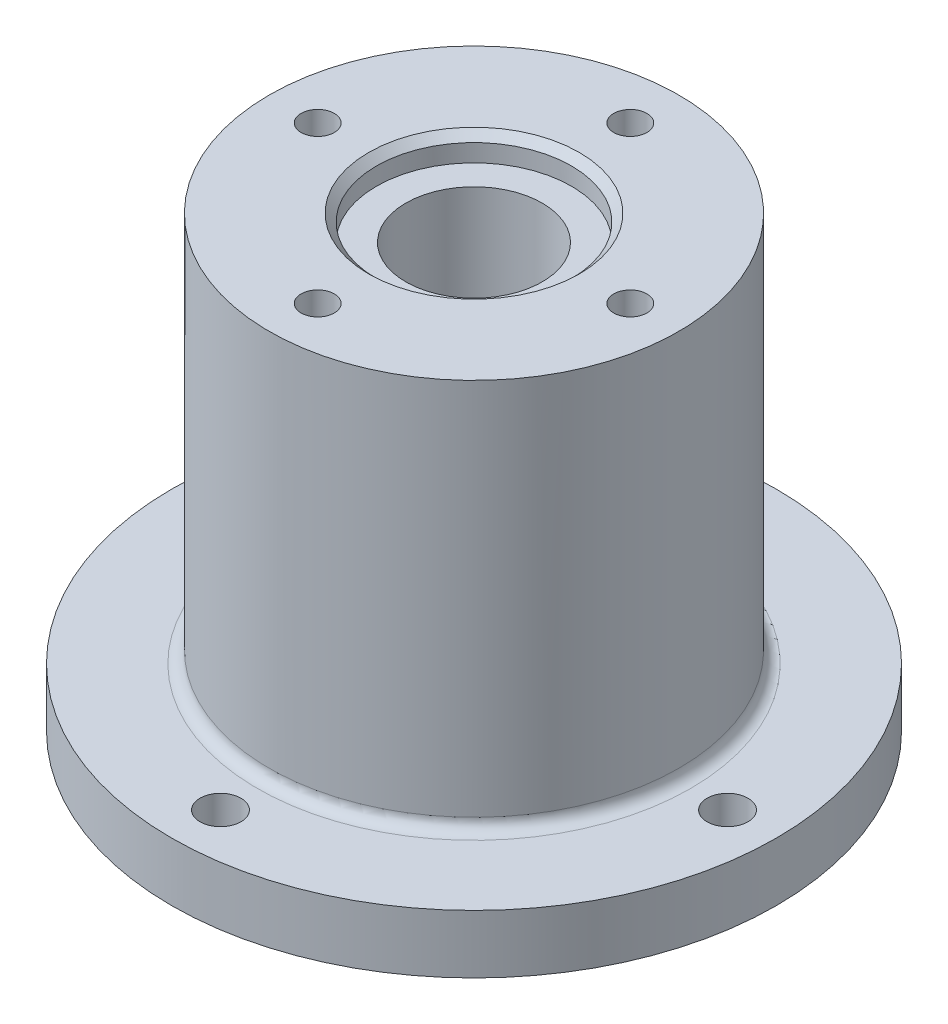
ISO-10303-21;
HEADER;
FILE_DESCRIPTION(('STEP AP214'),'2;1');
FILE_NAME('part.step','',(''),(''),'','','');
FILE_SCHEMA(('AUTOMOTIVE_DESIGN { 1 0 10303 214 1 1 1 1 }'));
ENDSEC;
DATA;
#1=APPLICATION_CONTEXT('core data for automotive mechanical design processes');
#2=APPLICATION_PROTOCOL_DEFINITION('international standard','automotive_design',2000,#1);
#3=PRODUCT_CONTEXT('',#1,'mechanical');
#4=PRODUCT('Part','Part','',(#3));
#5=PRODUCT_RELATED_PRODUCT_CATEGORY('part','',(#4));
#6=PRODUCT_DEFINITION_FORMATION('','',#4);
#7=PRODUCT_DEFINITION_CONTEXT('part definition',#1,'design');
#8=PRODUCT_DEFINITION('design','',#6,#7);
#9=PRODUCT_DEFINITION_SHAPE('','',#8);
#10=(LENGTH_UNIT() NAMED_UNIT(*) SI_UNIT(.MILLI.,.METRE.));
#11=(NAMED_UNIT(*) PLANE_ANGLE_UNIT() SI_UNIT($,.RADIAN.));
#12=(NAMED_UNIT(*) SI_UNIT($,.STERADIAN.) SOLID_ANGLE_UNIT());
#13=UNCERTAINTY_MEASURE_WITH_UNIT(LENGTH_MEASURE(1.E-05),#10,'distance_accuracy_value','');
#14=(GEOMETRIC_REPRESENTATION_CONTEXT(3) GLOBAL_UNCERTAINTY_ASSIGNED_CONTEXT((#13)) GLOBAL_UNIT_ASSIGNED_CONTEXT((#10,
#11,#12)) REPRESENTATION_CONTEXT('',''));
#15=CARTESIAN_POINT('',(0.,0.,0.));
#16=DIRECTION('',(0.,0.,1.));
#17=DIRECTION('',(1.,0.,0.));
#18=AXIS2_PLACEMENT_3D('',#15,#16,#17);
#19=CARTESIAN_POINT('',(52.5,115.,0.));
#20=DIRECTION('',(0.,-1.,0.));
#21=DIRECTION('',(1.,0.,0.));
#22=AXIS2_PLACEMENT_3D('',#19,#20,#21);
#23=PLANE('',#22);
#24=CARTESIAN_POINT('',(-4.3163367866924E-13,115.,-40.0726216412491));
#25=DIRECTION('',(0.,1.,0.));
#26=DIRECTION('',(0.,0.,1.));
#27=AXIS2_PLACEMENT_3D('',#24,#25,#26);
#28=CIRCLE('',#27,4.24999999999999);
#29=CARTESIAN_POINT('',(-4.3163367866924E-13,115.,-35.8226216412491));
#30=VERTEX_POINT('',#29);
#31=EDGE_CURVE('E89',#30,#30,#28,.T.);
#32=ORIENTED_EDGE('',*,*,#31,.F.);
#33=EDGE_LOOP('',(#32));
#34=FACE_BOUND('',#33,.T.);
#35=CARTESIAN_POINT('',(40.0726216412491,115.,0.));
#36=DIRECTION('',(0.,1.,0.));
#37=DIRECTION('',(0.,0.,1.));
#38=AXIS2_PLACEMENT_3D('',#35,#36,#37);
#39=CIRCLE('',#38,4.24999999999999);
#40=CARTESIAN_POINT('',(40.0726216412491,115.,4.24999999999999));
#41=VERTEX_POINT('',#40);
#42=EDGE_CURVE('E88',#41,#41,#39,.T.);
#43=ORIENTED_EDGE('',*,*,#42,.F.);
#44=EDGE_LOOP('',(#43));
#45=FACE_BOUND('',#44,.T.);
#46=CARTESIAN_POINT('',(1.2801756396653E-13,115.,40.0726216412491));
#47=DIRECTION('',(0.,1.,0.));
#48=DIRECTION('',(0.,0.,1.));
#49=AXIS2_PLACEMENT_3D('',#46,#47,#48);
#50=CIRCLE('',#49,4.24999999999999);
#51=CARTESIAN_POINT('',(1.2801756396653E-13,115.,44.3226216412491));
#52=VERTEX_POINT('',#51);
#53=EDGE_CURVE('E104',#52,#52,#50,.T.);
#54=ORIENTED_EDGE('',*,*,#53,.F.);
#55=EDGE_LOOP('',(#54));
#56=FACE_BOUND('',#55,.T.);
#57=CARTESIAN_POINT('',(-40.0726216412491,115.,0.));
#58=DIRECTION('',(0.,1.,0.));
#59=DIRECTION('',(0.,0.,1.));
#60=AXIS2_PLACEMENT_3D('',#57,#58,#59);
#61=CIRCLE('',#60,4.24999999999999);
#62=CARTESIAN_POINT('',(-40.0726216412491,115.,4.24999999999999));
#63=VERTEX_POINT('',#62);
#64=EDGE_CURVE('E112',#63,#63,#61,.T.);
#65=ORIENTED_EDGE('',*,*,#64,.F.);
#66=EDGE_LOOP('',(#65));
#67=FACE_BOUND('',#66,.T.);
#68=CARTESIAN_POINT('',(0.,115.,0.));
#69=DIRECTION('',(0.,-1.,0.));
#70=DIRECTION('',(1.,0.,0.));
#71=AXIS2_PLACEMENT_3D('',#68,#69,#70);
#72=CIRCLE('',#71,27.);
#73=CARTESIAN_POINT('',(27.,115.,0.));
#74=VERTEX_POINT('',#73);
#75=EDGE_CURVE('E11',#74,#74,#72,.T.);
#76=ORIENTED_EDGE('',*,*,#75,.T.);
#77=EDGE_LOOP('',(#76));
#78=FACE_BOUND('',#77,.T.);
#79=CARTESIAN_POINT('',(0.,115.,0.));
#80=DIRECTION('',(0.,1.,0.));
#81=DIRECTION('',(-1.,0.,0.));
#82=AXIS2_PLACEMENT_3D('',#79,#80,#81);
#83=CIRCLE('',#82,52.5);
#84=CARTESIAN_POINT('',(-52.5,115.,0.));
#85=VERTEX_POINT('',#84);
#86=EDGE_CURVE('E184',#85,#85,#83,.T.);
#87=ORIENTED_EDGE('',*,*,#86,.T.);
#88=EDGE_LOOP('',(#87));
#89=FACE_BOUND('',#88,.T.);
#90=ADVANCED_FACE('F55',(#34,#45,#56,#67,#78,#89),#23,.F.);
#91=CARTESIAN_POINT('',(0.,-0.774116111795951,0.));
#92=DIRECTION('',(0.,1.,0.));
#93=DIRECTION('',(-1.,0.,0.));
#94=AXIS2_PLACEMENT_3D('',#91,#92,#93);
#95=CYLINDRICAL_SURFACE('',#94,52.5);
#96=CARTESIAN_POINT('',(0.,18.,0.));
#97=DIRECTION('',(0.,-1.,0.));
#98=DIRECTION('',(1.,0.,0.));
#99=AXIS2_PLACEMENT_3D('',#96,#97,#98);
#100=CIRCLE('',#99,52.5);
#101=CARTESIAN_POINT('',(52.5,18.,0.));
#102=VERTEX_POINT('',#101);
#103=EDGE_CURVE('E188',#102,#102,#100,.F.);
#104=ORIENTED_EDGE('',*,*,#103,.T.);
#105=EDGE_LOOP('',(#104));
#106=FACE_BOUND('',#105,.T.);
#107=ORIENTED_EDGE('',*,*,#86,.F.);
#108=EDGE_LOOP('',(#107));
#109=FACE_BOUND('',#108,.T.);
#110=ADVANCED_FACE('F235',(#106,#109),#95,.T.);
#111=CARTESIAN_POINT('',(77.5,15.,0.));
#112=DIRECTION('',(0.,-1.,0.));
#113=DIRECTION('',(1.,0.,0.));
#114=AXIS2_PLACEMENT_3D('',#111,#112,#113);
#115=PLANE('',#114);
#116=CARTESIAN_POINT('',(0.,15.,-65.));
#117=DIRECTION('',(0.,1.,0.));
#118=DIRECTION('',(0.,0.,1.));
#119=AXIS2_PLACEMENT_3D('',#116,#117,#118);
#120=CIRCLE('',#119,5.24999999999999);
#121=CARTESIAN_POINT('',(0.,15.,-59.75));
#122=VERTEX_POINT('',#121);
#123=EDGE_CURVE('E120',#122,#122,#120,.T.);
#124=ORIENTED_EDGE('',*,*,#123,.F.);
#125=EDGE_LOOP('',(#124));
#126=FACE_BOUND('',#125,.T.);
#127=CARTESIAN_POINT('',(65.,15.,0.));
#128=DIRECTION('',(0.,1.,0.));
#129=DIRECTION('',(0.,0.,1.));
#130=AXIS2_PLACEMENT_3D('',#127,#128,#129);
#131=CIRCLE('',#130,5.24999999999999);
#132=CARTESIAN_POINT('',(65.,15.,5.24999999999999));
#133=VERTEX_POINT('',#132);
#134=EDGE_CURVE('E128',#133,#133,#131,.T.);
#135=ORIENTED_EDGE('',*,*,#134,.F.);
#136=EDGE_LOOP('',(#135));
#137=FACE_BOUND('',#136,.T.);
#138=CARTESIAN_POINT('',(0.,15.,65.));
#139=DIRECTION('',(0.,1.,0.));
#140=DIRECTION('',(0.,0.,1.));
#141=AXIS2_PLACEMENT_3D('',#138,#139,#140);
#142=CIRCLE('',#141,5.24999999999999);
#143=CARTESIAN_POINT('',(0.,15.,70.25));
#144=VERTEX_POINT('',#143);
#145=EDGE_CURVE('E136',#144,#144,#142,.T.);
#146=ORIENTED_EDGE('',*,*,#145,.F.);
#147=EDGE_LOOP('',(#146));
#148=FACE_BOUND('',#147,.T.);
#149=CARTESIAN_POINT('',(-65.,15.,0.));
#150=DIRECTION('',(0.,1.,0.));
#151=DIRECTION('',(0.,0.,1.));
#152=AXIS2_PLACEMENT_3D('',#149,#150,#151);
#153=CIRCLE('',#152,5.24999999999999);
#154=CARTESIAN_POINT('',(-65.,15.,5.24999999999999));
#155=VERTEX_POINT('',#154);
#156=EDGE_CURVE('E144',#155,#155,#153,.T.);
#157=ORIENTED_EDGE('',*,*,#156,.F.);
#158=EDGE_LOOP('',(#157));
#159=FACE_BOUND('',#158,.T.);
#160=CARTESIAN_POINT('',(0.,15.,0.));
#161=DIRECTION('',(0.,-1.,0.));
#162=DIRECTION('',(1.,0.,0.));
#163=AXIS2_PLACEMENT_3D('',#160,#161,#162);
#164=CIRCLE('',#163,55.5);
#165=CARTESIAN_POINT('',(55.5,15.,0.));
#166=VERTEX_POINT('',#165);
#167=EDGE_CURVE('E192',#166,#166,#164,.T.);
#168=ORIENTED_EDGE('',*,*,#167,.T.);
#169=EDGE_LOOP('',(#168));
#170=FACE_BOUND('',#169,.T.);
#171=CARTESIAN_POINT('',(0.,15.,0.));
#172=DIRECTION('',(0.,1.,0.));
#173=DIRECTION('',(-1.,0.,0.));
#174=AXIS2_PLACEMENT_3D('',#171,#172,#173);
#175=CIRCLE('',#174,77.5);
#176=CARTESIAN_POINT('',(-77.5,15.,0.));
#177=VERTEX_POINT('',#176);
#178=EDGE_CURVE('E180',#177,#177,#175,.T.);
#179=ORIENTED_EDGE('',*,*,#178,.T.);
#180=EDGE_LOOP('',(#179));
#181=FACE_BOUND('',#180,.T.);
#182=ADVANCED_FACE('F241',(#126,#137,#148,#159,#170,#181),#115,.F.);
#183=CARTESIAN_POINT('',(0.,-0.774116111795951,0.));
#184=DIRECTION('',(0.,1.,0.));
#185=DIRECTION('',(-1.,0.,0.));
#186=AXIS2_PLACEMENT_3D('',#183,#184,#185);
#187=CYLINDRICAL_SURFACE('',#186,77.5);
#188=ORIENTED_EDGE('',*,*,#178,.F.);
#189=EDGE_LOOP('',(#188));
#190=FACE_BOUND('',#189,.T.);
#191=CARTESIAN_POINT('',(0.,0.,0.));
#192=DIRECTION('',(0.,1.,0.));
#193=DIRECTION('',(-1.,0.,0.));
#194=AXIS2_PLACEMENT_3D('',#191,#192,#193);
#195=CIRCLE('',#194,77.5);
#196=CARTESIAN_POINT('',(-77.5,0.,0.));
#197=VERTEX_POINT('',#196);
#198=EDGE_CURVE('E176',#197,#197,#195,.T.);
#199=ORIENTED_EDGE('',*,*,#198,.T.);
#200=EDGE_LOOP('',(#199));
#201=FACE_BOUND('',#200,.T.);
#202=ADVANCED_FACE('F264',(#190,#201),#187,.T.);
#203=CARTESIAN_POINT('',(37.5,0.,0.));
#204=DIRECTION('',(0.,1.,0.));
#205=DIRECTION('',(-1.,0.,0.));
#206=AXIS2_PLACEMENT_3D('',#203,#204,#205);
#207=PLANE('',#206);
#208=CARTESIAN_POINT('',(0.,0.,-65.));
#209=DIRECTION('',(0.,1.,0.));
#210=DIRECTION('',(0.,0.,1.));
#211=AXIS2_PLACEMENT_3D('',#208,#209,#210);
#212=CIRCLE('',#211,5.24999999999999);
#213=CARTESIAN_POINT('',(0.,0.,-59.75));
#214=VERTEX_POINT('',#213);
#215=EDGE_CURVE('E124',#214,#214,#212,.T.);
#216=ORIENTED_EDGE('',*,*,#215,.T.);
#217=EDGE_LOOP('',(#216));
#218=FACE_BOUND('',#217,.T.);
#219=CARTESIAN_POINT('',(65.,0.,0.));
#220=DIRECTION('',(0.,1.,0.));
#221=DIRECTION('',(0.,0.,1.));
#222=AXIS2_PLACEMENT_3D('',#219,#220,#221);
#223=CIRCLE('',#222,5.24999999999999);
#224=CARTESIAN_POINT('',(65.,0.,5.24999999999999));
#225=VERTEX_POINT('',#224);
#226=EDGE_CURVE('E132',#225,#225,#223,.T.);
#227=ORIENTED_EDGE('',*,*,#226,.T.);
#228=EDGE_LOOP('',(#227));
#229=FACE_BOUND('',#228,.T.);
#230=CARTESIAN_POINT('',(0.,0.,65.));
#231=DIRECTION('',(0.,1.,0.));
#232=DIRECTION('',(0.,0.,1.));
#233=AXIS2_PLACEMENT_3D('',#230,#231,#232);
#234=CIRCLE('',#233,5.24999999999999);
#235=CARTESIAN_POINT('',(0.,0.,70.25));
#236=VERTEX_POINT('',#235);
#237=EDGE_CURVE('E140',#236,#236,#234,.T.);
#238=ORIENTED_EDGE('',*,*,#237,.T.);
#239=EDGE_LOOP('',(#238));
#240=FACE_BOUND('',#239,.T.);
#241=CARTESIAN_POINT('',(-65.,0.,0.));
#242=DIRECTION('',(0.,1.,0.));
#243=DIRECTION('',(0.,0.,1.));
#244=AXIS2_PLACEMENT_3D('',#241,#242,#243);
#245=CIRCLE('',#244,5.24999999999998);
#246=CARTESIAN_POINT('',(-65.,0.,5.24999999999998));
#247=VERTEX_POINT('',#246);
#248=EDGE_CURVE('E148',#247,#247,#245,.T.);
#249=ORIENTED_EDGE('',*,*,#248,.T.);
#250=EDGE_LOOP('',(#249));
#251=FACE_BOUND('',#250,.T.);
#252=CARTESIAN_POINT('',(0.,0.,0.));
#253=DIRECTION('',(0.,1.,0.));
#254=DIRECTION('',(-1.,0.,0.));
#255=AXIS2_PLACEMENT_3D('',#252,#253,#254);
#256=CIRCLE('',#255,40.3867513459481);
#257=CARTESIAN_POINT('',(-40.3867513459481,0.,0.));
#258=VERTEX_POINT('',#257);
#259=EDGE_CURVE('E196',#258,#258,#256,.T.);
#260=ORIENTED_EDGE('',*,*,#259,.T.);
#261=EDGE_LOOP('',(#260));
#262=FACE_BOUND('',#261,.T.);
#263=ORIENTED_EDGE('',*,*,#198,.F.);
#264=EDGE_LOOP('',(#263));
#265=FACE_BOUND('',#264,.T.);
#266=ADVANCED_FACE('F260',(#218,#229,#240,#251,#262,#265),#207,.F.);
#267=CARTESIAN_POINT('',(0.,32.5,0.));
#268=DIRECTION('',(0.,-1.,0.));
#269=DIRECTION('',(1.,0.,0.));
#270=AXIS2_PLACEMENT_3D('',#267,#268,#269);
#271=CONICAL_SURFACE('',#270,18.7361162513373,0.523598775598297);
#272=CARTESIAN_POINT('',(0.,2.5,0.));
#273=DIRECTION('',(0.,1.,0.));
#274=DIRECTION('',(-1.,0.,0.));
#275=AXIS2_PLACEMENT_3D('',#272,#273,#274);
#276=CIRCLE('',#275,36.0566243270259);
#277=CARTESIAN_POINT('',(-36.0566243270259,2.5,0.));
#278=VERTEX_POINT('',#277);
#279=EDGE_CURVE('E200',#278,#278,#276,.F.);
#280=ORIENTED_EDGE('',*,*,#279,.T.);
#281=EDGE_LOOP('',(#280));
#282=FACE_BOUND('',#281,.T.);
#283=CARTESIAN_POINT('',(0.,32.5,0.));
#284=DIRECTION('',(0.,1.,0.));
#285=DIRECTION('',(-1.,0.,0.));
#286=AXIS2_PLACEMENT_3D('',#283,#284,#285);
#287=CIRCLE('',#286,18.7361162513373);
#288=CARTESIAN_POINT('',(-18.7361162513373,32.5,0.));
#289=VERTEX_POINT('',#288);
#290=EDGE_CURVE('E172',#289,#289,#287,.T.);
#291=ORIENTED_EDGE('',*,*,#290,.T.);
#292=EDGE_LOOP('',(#291));
#293=FACE_BOUND('',#292,.T.);
#294=ADVANCED_FACE('F263',(#282,#293),#271,.F.);
#295=CARTESIAN_POINT('',(0.,30.,0.));
#296=DIRECTION('',(0.,1.,0.));
#297=DIRECTION('',(-1.,0.,0.));
#298=AXIS2_PLACEMENT_3D('',#295,#296,#297);
#299=TOROIDAL_SURFACE('',#298,14.4059892324151,5.);
#300=ORIENTED_EDGE('',*,*,#290,.F.);
#301=EDGE_LOOP('',(#300));
#302=FACE_BOUND('',#301,.T.);
#303=CARTESIAN_POINT('',(0.,35.,0.));
#304=DIRECTION('',(0.,1.,0.));
#305=DIRECTION('',(-1.,0.,0.));
#306=AXIS2_PLACEMENT_3D('',#303,#304,#305);
#307=CIRCLE('',#306,14.4059892324151);
#308=CARTESIAN_POINT('',(-14.4059892324151,35.,0.));
#309=VERTEX_POINT('',#308);
#310=EDGE_CURVE('E168',#309,#309,#307,.T.);
#311=ORIENTED_EDGE('',*,*,#310,.T.);
#312=EDGE_LOOP('',(#311));
#313=FACE_BOUND('',#312,.T.);
#314=ADVANCED_FACE('F280',(#302,#313),#299,.F.);
#315=CARTESIAN_POINT('',(8.,35.,0.));
#316=DIRECTION('',(0.,1.,0.));
#317=DIRECTION('',(-1.,0.,0.));
#318=AXIS2_PLACEMENT_3D('',#315,#316,#317);
#319=PLANE('',#318);
#320=ORIENTED_EDGE('',*,*,#310,.F.);
#321=EDGE_LOOP('',(#320));
#322=FACE_BOUND('',#321,.T.);
#323=CARTESIAN_POINT('',(0.,35.,0.));
#324=DIRECTION('',(0.,1.,0.));
#325=DIRECTION('',(-1.,0.,0.));
#326=AXIS2_PLACEMENT_3D('',#323,#324,#325);
#327=CIRCLE('',#326,8.);
#328=CARTESIAN_POINT('',(-8.,35.,0.));
#329=VERTEX_POINT('',#328);
#330=EDGE_CURVE('E164',#329,#329,#327,.T.);
#331=ORIENTED_EDGE('',*,*,#330,.T.);
#332=EDGE_LOOP('',(#331));
#333=FACE_BOUND('',#332,.T.);
#334=ADVANCED_FACE('F284',(#322,#333),#319,.F.);
#335=CARTESIAN_POINT('',(0.,-0.774116111795951,0.));
#336=DIRECTION('',(0.,1.,0.));
#337=DIRECTION('',(-1.,0.,0.));
#338=AXIS2_PLACEMENT_3D('',#335,#336,#337);
#339=CYLINDRICAL_SURFACE('',#338,8.);
#340=ORIENTED_EDGE('',*,*,#330,.F.);
#341=EDGE_LOOP('',(#340));
#342=FACE_BOUND('',#341,.T.);
#343=CARTESIAN_POINT('',(0.,51.,0.));
#344=DIRECTION('',(0.,1.,0.));
#345=DIRECTION('',(-1.,0.,0.));
#346=AXIS2_PLACEMENT_3D('',#343,#344,#345);
#347=CIRCLE('',#346,8.);
#348=CARTESIAN_POINT('',(-8.00000000000001,51.,0.));
#349=VERTEX_POINT('',#348);
#350=EDGE_CURVE('E160',#349,#349,#347,.T.);
#351=ORIENTED_EDGE('',*,*,#350,.T.);
#352=EDGE_LOOP('',(#351));
#353=FACE_BOUND('',#352,.T.);
#354=ADVANCED_FACE('F288',(#342,#353),#339,.F.);
#355=CARTESIAN_POINT('',(17.5,51.,0.));
#356=DIRECTION('',(0.,-1.,0.));
#357=DIRECTION('',(1.,0.,0.));
#358=AXIS2_PLACEMENT_3D('',#355,#356,#357);
#359=PLANE('',#358);
#360=CARTESIAN_POINT('',(0.,51.,0.));
#361=DIRECTION('',(0.,-1.,0.));
#362=DIRECTION('',(1.,0.,0.));
#363=AXIS2_PLACEMENT_3D('',#360,#361,#362);
#364=CIRCLE('',#363,15.);
#365=CARTESIAN_POINT('',(15.,51.,0.));
#366=VERTEX_POINT('',#365);
#367=EDGE_CURVE('E204',#366,#366,#364,.F.);
#368=ORIENTED_EDGE('',*,*,#367,.T.);
#369=EDGE_LOOP('',(#368));
#370=FACE_BOUND('',#369,.T.);
#371=ORIENTED_EDGE('',*,*,#350,.F.);
#372=EDGE_LOOP('',(#371));
#373=FACE_BOUND('',#372,.T.);
#374=ADVANCED_FACE('F292',(#370,#373),#359,.F.);
#375=CARTESIAN_POINT('',(0.,-0.774116111795951,0.));
#376=DIRECTION('',(0.,1.,0.));
#377=DIRECTION('',(-1.,0.,0.));
#378=AXIS2_PLACEMENT_3D('',#375,#376,#377);
#379=CYLINDRICAL_SURFACE('',#378,17.5);
#380=CARTESIAN_POINT('',(0.,53.5,0.));
#381=DIRECTION('',(0.,-1.,0.));
#382=DIRECTION('',(1.,0.,0.));
#383=AXIS2_PLACEMENT_3D('',#380,#381,#382);
#384=CIRCLE('',#383,17.5);
#385=CARTESIAN_POINT('',(17.5,53.5,0.));
#386=VERTEX_POINT('',#385);
#387=EDGE_CURVE('E208',#386,#386,#384,.T.);
#388=ORIENTED_EDGE('',*,*,#387,.T.);
#389=EDGE_LOOP('',(#388));
#390=FACE_BOUND('',#389,.T.);
#391=CARTESIAN_POINT('',(0.,108.5,0.));
#392=DIRECTION('',(0.,1.,0.));
#393=DIRECTION('',(-1.,0.,0.));
#394=AXIS2_PLACEMENT_3D('',#391,#392,#393);
#395=CIRCLE('',#394,17.5);
#396=CARTESIAN_POINT('',(-17.5,108.5,0.));
#397=VERTEX_POINT('',#396);
#398=EDGE_CURVE('E156',#397,#397,#395,.T.);
#399=ORIENTED_EDGE('',*,*,#398,.T.);
#400=EDGE_LOOP('',(#399));
#401=FACE_BOUND('',#400,.T.);
#402=ADVANCED_FACE('F296',(#390,#401),#379,.F.);
#403=CARTESIAN_POINT('',(25.,108.5,0.));
#404=DIRECTION('',(0.,-1.,0.));
#405=DIRECTION('',(1.,0.,0.));
#406=AXIS2_PLACEMENT_3D('',#403,#404,#405);
#407=PLANE('',#406);
#408=ORIENTED_EDGE('',*,*,#398,.F.);
#409=EDGE_LOOP('',(#408));
#410=FACE_BOUND('',#409,.T.);
#411=CARTESIAN_POINT('',(0.,108.5,0.));
#412=DIRECTION('',(0.,1.,0.));
#413=DIRECTION('',(-1.,0.,0.));
#414=AXIS2_PLACEMENT_3D('',#411,#412,#413);
#415=CIRCLE('',#414,25.);
#416=CARTESIAN_POINT('',(-25.,108.5,0.));
#417=VERTEX_POINT('',#416);
#418=EDGE_CURVE('E152',#417,#417,#415,.T.);
#419=ORIENTED_EDGE('',*,*,#418,.T.);
#420=EDGE_LOOP('',(#419));
#421=FACE_BOUND('',#420,.T.);
#422=ADVANCED_FACE('F300',(#410,#421),#407,.F.);
#423=CARTESIAN_POINT('',(0.,-0.774116111795951,0.));
#424=DIRECTION('',(0.,1.,0.));
#425=DIRECTION('',(-1.,0.,0.));
#426=AXIS2_PLACEMENT_3D('',#423,#424,#425);
#427=CYLINDRICAL_SURFACE('',#426,25.);
#428=CARTESIAN_POINT('',(0.,113.,0.));
#429=DIRECTION('',(0.,-1.,0.));
#430=DIRECTION('',(1.,0.,0.));
#431=AXIS2_PLACEMENT_3D('',#428,#429,#430);
#432=CIRCLE('',#431,25.);
#433=CARTESIAN_POINT('',(25.,113.,0.));
#434=VERTEX_POINT('',#433);
#435=EDGE_CURVE('E64',#434,#434,#432,.F.);
#436=ORIENTED_EDGE('',*,*,#435,.T.);
#437=EDGE_LOOP('',(#436));
#438=FACE_BOUND('',#437,.T.);
#439=ORIENTED_EDGE('',*,*,#418,.F.);
#440=EDGE_LOOP('',(#439));
#441=FACE_BOUND('',#440,.T.);
#442=ADVANCED_FACE('F217',(#438,#441),#427,.F.);
#443=CARTESIAN_POINT('',(0.,18.,0.));
#444=DIRECTION('',(0.,-1.,0.));
#445=DIRECTION('',(1.,0.,0.));
#446=AXIS2_PLACEMENT_3D('',#443,#444,#445);
#447=TOROIDAL_SURFACE('',#446,55.5,3.);
#448=ORIENTED_EDGE('',*,*,#167,.F.);
#449=EDGE_LOOP('',(#448));
#450=FACE_BOUND('',#449,.T.);
#451=ORIENTED_EDGE('',*,*,#103,.F.);
#452=EDGE_LOOP('',(#451));
#453=FACE_BOUND('',#452,.T.);
#454=ADVANCED_FACE('F248',(#450,#453),#447,.F.);
#455=CARTESIAN_POINT('',(0.,4.99999999999999,0.));
#456=DIRECTION('',(0.,1.,0.));
#457=DIRECTION('',(-1.,0.,0.));
#458=AXIS2_PLACEMENT_3D('',#455,#456,#457);
#459=TOROIDAL_SURFACE('',#458,40.3867513459481,5.);
#460=ORIENTED_EDGE('',*,*,#279,.F.);
#461=EDGE_LOOP('',(#460));
#462=FACE_BOUND('',#461,.T.);
#463=ORIENTED_EDGE('',*,*,#259,.F.);
#464=EDGE_LOOP('',(#463));
#465=FACE_BOUND('',#464,.T.);
#466=ADVANCED_FACE('F231',(#462,#465),#459,.T.);
#467=CARTESIAN_POINT('',(0.,53.5,0.));
#468=DIRECTION('',(0.,-1.,0.));
#469=DIRECTION('',(1.,0.,0.));
#470=AXIS2_PLACEMENT_3D('',#467,#468,#469);
#471=TOROIDAL_SURFACE('',#470,15.,2.5);
#472=ORIENTED_EDGE('',*,*,#387,.F.);
#473=EDGE_LOOP('',(#472));
#474=FACE_BOUND('',#473,.T.);
#475=ORIENTED_EDGE('',*,*,#367,.F.);
#476=EDGE_LOOP('',(#475));
#477=FACE_BOUND('',#476,.T.);
#478=ADVANCED_FACE('F222',(#474,#477),#471,.F.);
#479=CARTESIAN_POINT('',(0.,113.,0.));
#480=DIRECTION('',(0.,1.,0.));
#481=DIRECTION('',(-1.,0.,0.));
#482=AXIS2_PLACEMENT_3D('',#479,#480,#481);
#483=CONICAL_SURFACE('',#482,25.,0.785398163397453);
#484=ORIENTED_EDGE('',*,*,#75,.F.);
#485=EDGE_LOOP('',(#484));
#486=FACE_BOUND('',#485,.T.);
#487=ORIENTED_EDGE('',*,*,#435,.F.);
#488=EDGE_LOOP('',(#487));
#489=FACE_BOUND('',#488,.T.);
#490=ADVANCED_FACE('F57',(#486,#489),#483,.F.);
#491=CARTESIAN_POINT('',(-65.,15.,0.));
#492=DIRECTION('',(0.,1.,0.));
#493=DIRECTION('',(0.,0.,1.));
#494=AXIS2_PLACEMENT_3D('',#491,#492,#493);
#495=CYLINDRICAL_SURFACE('',#494,5.24999999999999);
#496=ORIENTED_EDGE('',*,*,#248,.F.);
#497=EDGE_LOOP('',(#496));
#498=FACE_BOUND('',#497,.T.);
#499=ORIENTED_EDGE('',*,*,#156,.T.);
#500=EDGE_LOOP('',(#499));
#501=FACE_BOUND('',#500,.T.);
#502=ADVANCED_FACE('F221',(#498,#501),#495,.F.);
#503=CARTESIAN_POINT('',(0.,15.,65.));
#504=DIRECTION('',(0.,1.,0.));
#505=DIRECTION('',(0.,0.,1.));
#506=AXIS2_PLACEMENT_3D('',#503,#504,#505);
#507=CYLINDRICAL_SURFACE('',#506,5.24999999999999);
#508=ORIENTED_EDGE('',*,*,#237,.F.);
#509=EDGE_LOOP('',(#508));
#510=FACE_BOUND('',#509,.T.);
#511=ORIENTED_EDGE('',*,*,#145,.T.);
#512=EDGE_LOOP('',(#511));
#513=FACE_BOUND('',#512,.T.);
#514=ADVANCED_FACE('F228',(#510,#513),#507,.F.);
#515=CARTESIAN_POINT('',(65.,15.,0.));
#516=DIRECTION('',(0.,1.,0.));
#517=DIRECTION('',(0.,0.,1.));
#518=AXIS2_PLACEMENT_3D('',#515,#516,#517);
#519=CYLINDRICAL_SURFACE('',#518,5.24999999999999);
#520=ORIENTED_EDGE('',*,*,#226,.F.);
#521=EDGE_LOOP('',(#520));
#522=FACE_BOUND('',#521,.T.);
#523=ORIENTED_EDGE('',*,*,#134,.T.);
#524=EDGE_LOOP('',(#523));
#525=FACE_BOUND('',#524,.T.);
#526=ADVANCED_FACE('F309',(#522,#525),#519,.F.);
#527=CARTESIAN_POINT('',(0.,15.,-65.));
#528=DIRECTION('',(0.,1.,0.));
#529=DIRECTION('',(0.,0.,1.));
#530=AXIS2_PLACEMENT_3D('',#527,#528,#529);
#531=CYLINDRICAL_SURFACE('',#530,5.24999999999999);
#532=ORIENTED_EDGE('',*,*,#215,.F.);
#533=EDGE_LOOP('',(#532));
#534=FACE_BOUND('',#533,.T.);
#535=ORIENTED_EDGE('',*,*,#123,.T.);
#536=EDGE_LOOP('',(#535));
#537=FACE_BOUND('',#536,.T.);
#538=ADVANCED_FACE('F313',(#534,#537),#531,.F.);
#539=CARTESIAN_POINT('',(-40.0726216412491,87.5,0.));
#540=DIRECTION('',(0.,1.,0.));
#541=DIRECTION('',(0.,0.,1.));
#542=AXIS2_PLACEMENT_3D('',#539,#540,#541);
#543=CONICAL_SURFACE('',#542,4.24999999999998,1.02974425867665);
#544=CARTESIAN_POINT('',(-40.0726216412491,84.9463423691329,0.));
#545=VERTEX_POINT('',#544);
#546=VERTEX_LOOP('',#545);
#547=FACE_BOUND('',#546,.T.);
#548=CARTESIAN_POINT('',(-40.0726216412491,87.5,0.));
#549=DIRECTION('',(0.,1.,0.));
#550=DIRECTION('',(0.,0.,1.));
#551=AXIS2_PLACEMENT_3D('',#548,#549,#550);
#552=CIRCLE('',#551,4.24999999999998);
#553=CARTESIAN_POINT('',(-40.0726216412491,87.5,4.24999999999998));
#554=VERTEX_POINT('',#553);
#555=EDGE_CURVE('E116',#554,#554,#552,.T.);
#556=ORIENTED_EDGE('',*,*,#555,.T.);
#557=EDGE_LOOP('',(#556));
#558=FACE_BOUND('',#557,.T.);
#559=ADVANCED_FACE('F317',(#547,#558),#543,.F.);
#560=CARTESIAN_POINT('',(-40.0726216412491,115.,0.));
#561=DIRECTION('',(0.,1.,0.));
#562=DIRECTION('',(0.,0.,1.));
#563=AXIS2_PLACEMENT_3D('',#560,#561,#562);
#564=CYLINDRICAL_SURFACE('',#563,4.24999999999999);
#565=ORIENTED_EDGE('',*,*,#555,.F.);
#566=EDGE_LOOP('',(#565));
#567=FACE_BOUND('',#566,.T.);
#568=ORIENTED_EDGE('',*,*,#64,.T.);
#569=EDGE_LOOP('',(#568));
#570=FACE_BOUND('',#569,.T.);
#571=ADVANCED_FACE('F321',(#567,#570),#564,.F.);
#572=CARTESIAN_POINT('',(1.2801756396653E-13,87.5,40.0726216412491));
#573=DIRECTION('',(0.,1.,0.));
#574=DIRECTION('',(0.,0.,1.));
#575=AXIS2_PLACEMENT_3D('',#572,#573,#574);
#576=CONICAL_SURFACE('',#575,4.24999999999999,1.02974425867665);
#577=CARTESIAN_POINT('',(1.20656540842468E-13,84.9463423691329,40.0726216412491));
#578=VERTEX_POINT('',#577);
#579=VERTEX_LOOP('',#578);
#580=FACE_BOUND('',#579,.T.);
#581=CARTESIAN_POINT('',(1.2801756396653E-13,87.5,40.0726216412491));
#582=DIRECTION('',(0.,1.,0.));
#583=DIRECTION('',(0.,0.,1.));
#584=AXIS2_PLACEMENT_3D('',#581,#582,#583);
#585=CIRCLE('',#584,4.24999999999999);
#586=CARTESIAN_POINT('',(1.2801756396653E-13,87.5,44.3226216412491));
#587=VERTEX_POINT('',#586);
#588=EDGE_CURVE('E108',#587,#587,#585,.T.);
#589=ORIENTED_EDGE('',*,*,#588,.T.);
#590=EDGE_LOOP('',(#589));
#591=FACE_BOUND('',#590,.T.);
#592=ADVANCED_FACE('F324',(#580,#591),#576,.F.);
#593=CARTESIAN_POINT('',(1.2801756396653E-13,115.,40.0726216412491));
#594=DIRECTION('',(0.,1.,0.));
#595=DIRECTION('',(0.,0.,1.));
#596=AXIS2_PLACEMENT_3D('',#593,#594,#595);
#597=CYLINDRICAL_SURFACE('',#596,4.24999999999999);
#598=ORIENTED_EDGE('',*,*,#588,.F.);
#599=EDGE_LOOP('',(#598));
#600=FACE_BOUND('',#599,.T.);
#601=ORIENTED_EDGE('',*,*,#53,.T.);
#602=EDGE_LOOP('',(#601));
#603=FACE_BOUND('',#602,.T.);
#604=ADVANCED_FACE('F328',(#600,#603),#597,.F.);
#605=CARTESIAN_POINT('',(40.0726216412491,87.5,0.));
#606=DIRECTION('',(0.,1.,0.));
#607=DIRECTION('',(0.,0.,1.));
#608=AXIS2_PLACEMENT_3D('',#605,#606,#607);
#609=CONICAL_SURFACE('',#608,4.24999999999998,1.02974425867665);
#610=CARTESIAN_POINT('',(40.0726216412491,84.9463423691329,0.));
#611=VERTEX_POINT('',#610);
#612=VERTEX_LOOP('',#611);
#613=FACE_BOUND('',#612,.T.);
#614=CARTESIAN_POINT('',(40.0726216412491,87.5,0.));
#615=DIRECTION('',(0.,1.,0.));
#616=DIRECTION('',(0.,0.,1.));
#617=AXIS2_PLACEMENT_3D('',#614,#615,#616);
#618=CIRCLE('',#617,4.24999999999998);
#619=CARTESIAN_POINT('',(40.0726216412491,87.5,4.24999999999998));
#620=VERTEX_POINT('',#619);
#621=EDGE_CURVE('E96',#620,#620,#618,.T.);
#622=ORIENTED_EDGE('',*,*,#621,.T.);
#623=EDGE_LOOP('',(#622));
#624=FACE_BOUND('',#623,.T.);
#625=ADVANCED_FACE('F331',(#613,#624),#609,.F.);
#626=CARTESIAN_POINT('',(40.0726216412491,115.,0.));
#627=DIRECTION('',(0.,1.,0.));
#628=DIRECTION('',(0.,0.,1.));
#629=AXIS2_PLACEMENT_3D('',#626,#627,#628);
#630=CYLINDRICAL_SURFACE('',#629,4.24999999999999);
#631=ORIENTED_EDGE('',*,*,#621,.F.);
#632=EDGE_LOOP('',(#631));
#633=FACE_BOUND('',#632,.T.);
#634=ORIENTED_EDGE('',*,*,#42,.T.);
#635=EDGE_LOOP('',(#634));
#636=FACE_BOUND('',#635,.T.);
#637=ADVANCED_FACE('F81',(#633,#636),#630,.F.);
#638=CARTESIAN_POINT('',(-4.3163367866924E-13,87.5,-40.0726216412491));
#639=DIRECTION('',(0.,1.,0.));
#640=DIRECTION('',(0.,0.,1.));
#641=AXIS2_PLACEMENT_3D('',#638,#639,#640);
#642=CONICAL_SURFACE('',#641,4.24999999999999,1.02974425867665);
#643=CARTESIAN_POINT('',(-4.38994701793303E-13,84.9463423691329,-40.0726216412491));
#644=VERTEX_POINT('',#643);
#645=VERTEX_LOOP('',#644);
#646=FACE_BOUND('',#645,.T.);
#647=CARTESIAN_POINT('',(-4.3163367866924E-13,87.5,-40.0726216412491));
#648=DIRECTION('',(0.,1.,0.));
#649=DIRECTION('',(0.,0.,1.));
#650=AXIS2_PLACEMENT_3D('',#647,#648,#649);
#651=CIRCLE('',#650,4.24999999999999);
#652=CARTESIAN_POINT('',(-4.3163367866924E-13,87.5,-35.8226216412491));
#653=VERTEX_POINT('',#652);
#654=EDGE_CURVE('E85',#653,#653,#651,.T.);
#655=ORIENTED_EDGE('',*,*,#654,.T.);
#656=EDGE_LOOP('',(#655));
#657=FACE_BOUND('',#656,.T.);
#658=ADVANCED_FACE('F77',(#646,#657),#642,.F.);
#659=CARTESIAN_POINT('',(-4.3163367866924E-13,115.,-40.0726216412491));
#660=DIRECTION('',(0.,1.,0.));
#661=DIRECTION('',(0.,0.,1.));
#662=AXIS2_PLACEMENT_3D('',#659,#660,#661);
#663=CYLINDRICAL_SURFACE('',#662,4.24999999999999);
#664=ORIENTED_EDGE('',*,*,#654,.F.);
#665=EDGE_LOOP('',(#664));
#666=FACE_BOUND('',#665,.T.);
#667=ORIENTED_EDGE('',*,*,#31,.T.);
#668=EDGE_LOOP('',(#667));
#669=FACE_BOUND('',#668,.T.);
#670=ADVANCED_FACE('F80',(#666,#669),#663,.F.);
#671=CLOSED_SHELL('',(#90,#110,#182,#202,#266,#294,#314,#334,#354,#374,#402,#422,#442,#454,#466,
#478,#490,#502,#514,#526,#538,#559,#571,#592,#604,#625,#637,#658,#670));
#672=MANIFOLD_SOLID_BREP('B2',#671);
#673=ADVANCED_BREP_SHAPE_REPRESENTATION('',(#18,#672),#14);
#674=SHAPE_DEFINITION_REPRESENTATION(#9,#673);
ENDSEC;
END-ISO-10303-21;
